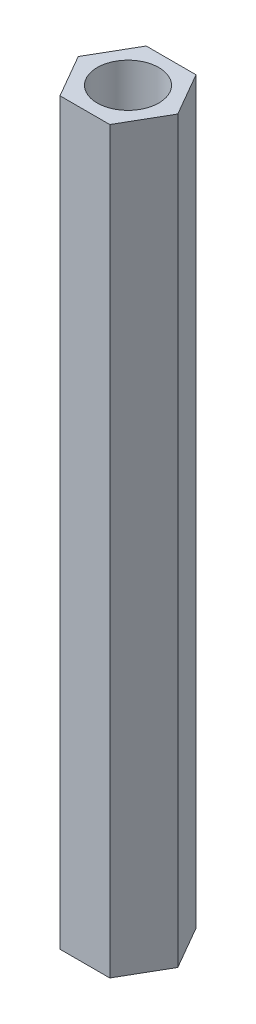
ISO-10303-21;
HEADER;
FILE_DESCRIPTION(('STEP AP214'),'2;1');
FILE_NAME('part.step','',(''),(''),'','','');
FILE_SCHEMA(('AUTOMOTIVE_DESIGN { 1 0 10303 214 1 1 1 1 }'));
ENDSEC;
DATA;
#1=APPLICATION_CONTEXT('core data for automotive mechanical design processes');
#2=APPLICATION_PROTOCOL_DEFINITION('international standard','automotive_design',2000,#1);
#3=PRODUCT_CONTEXT('',#1,'mechanical');
#4=PRODUCT('Part','Part','',(#3));
#5=PRODUCT_RELATED_PRODUCT_CATEGORY('part','',(#4));
#6=PRODUCT_DEFINITION_FORMATION('','',#4);
#7=PRODUCT_DEFINITION_CONTEXT('part definition',#1,'design');
#8=PRODUCT_DEFINITION('design','',#6,#7);
#9=PRODUCT_DEFINITION_SHAPE('','',#8);
#10=(LENGTH_UNIT() NAMED_UNIT(*) SI_UNIT(.MILLI.,.METRE.));
#11=(NAMED_UNIT(*) PLANE_ANGLE_UNIT() SI_UNIT($,.RADIAN.));
#12=(NAMED_UNIT(*) SI_UNIT($,.STERADIAN.) SOLID_ANGLE_UNIT());
#13=UNCERTAINTY_MEASURE_WITH_UNIT(LENGTH_MEASURE(1.E-05),#10,'distance_accuracy_value','');
#14=(GEOMETRIC_REPRESENTATION_CONTEXT(3) GLOBAL_UNCERTAINTY_ASSIGNED_CONTEXT((#13)) GLOBAL_UNIT_ASSIGNED_CONTEXT((#10,
#11,#12)) REPRESENTATION_CONTEXT('',''));
#15=CARTESIAN_POINT('',(0.,0.,0.));
#16=DIRECTION('',(0.,0.,1.));
#17=DIRECTION('',(1.,0.,0.));
#18=AXIS2_PLACEMENT_3D('',#15,#16,#17);
#19=CARTESIAN_POINT('',(0.,60.,0.));
#20=DIRECTION('',(0.,1.,0.));
#21=DIRECTION('',(0.,0.,1.));
#22=AXIS2_PLACEMENT_3D('',#19,#20,#21);
#23=PLANE('',#22);
#24=DIRECTION('',(-0.5,0.,-0.866025403784439));
#25=VECTOR('',#24,1.);
#26=CARTESIAN_POINT('',(4.04145188432738,60.,0.));
#27=LINE('',#26,#25);
#28=CARTESIAN_POINT('',(4.04145188432738,60.,0.));
#29=VERTEX_POINT('',#28);
#30=CARTESIAN_POINT('',(2.02072594216369,60.,-3.5));
#31=VERTEX_POINT('',#30);
#32=EDGE_CURVE('E152',#29,#31,#27,.T.);
#33=ORIENTED_EDGE('',*,*,#32,.T.);
#34=DIRECTION('',(-1.,0.,0.));
#35=VECTOR('',#34,1.);
#36=CARTESIAN_POINT('',(2.02072594216369,60.,-3.5));
#37=LINE('',#36,#35);
#38=CARTESIAN_POINT('',(-2.02072594216369,60.,-3.5));
#39=VERTEX_POINT('',#38);
#40=EDGE_CURVE('E100',#31,#39,#37,.T.);
#41=ORIENTED_EDGE('',*,*,#40,.T.);
#42=DIRECTION('',(-0.5,0.,0.866025403784439));
#43=VECTOR('',#42,1.);
#44=CARTESIAN_POINT('',(-2.02072594216369,60.,-3.5));
#45=LINE('',#44,#43);
#46=CARTESIAN_POINT('',(-4.04145188432738,60.,0.));
#47=VERTEX_POINT('',#46);
#48=EDGE_CURVE('E113',#39,#47,#45,.T.);
#49=ORIENTED_EDGE('',*,*,#48,.T.);
#50=DIRECTION('',(0.5,0.,0.866025403784439));
#51=VECTOR('',#50,1.);
#52=CARTESIAN_POINT('',(-4.04145188432738,60.,0.));
#53=LINE('',#52,#51);
#54=CARTESIAN_POINT('',(-2.02072594216369,60.,3.5));
#55=VERTEX_POINT('',#54);
#56=EDGE_CURVE('E107',#47,#55,#53,.T.);
#57=ORIENTED_EDGE('',*,*,#56,.T.);
#58=DIRECTION('',(1.,0.,0.));
#59=VECTOR('',#58,1.);
#60=CARTESIAN_POINT('',(-2.02072594216369,60.,3.5));
#61=LINE('',#60,#59);
#62=CARTESIAN_POINT('',(2.02072594216369,60.,3.5));
#63=VERTEX_POINT('',#62);
#64=EDGE_CURVE('E111',#55,#63,#61,.T.);
#65=ORIENTED_EDGE('',*,*,#64,.T.);
#66=DIRECTION('',(0.5,0.,-0.866025403784438));
#67=VECTOR('',#66,1.);
#68=CARTESIAN_POINT('',(2.02072594216369,60.,3.5));
#69=LINE('',#68,#67);
#70=EDGE_CURVE('E63',#63,#29,#69,.T.);
#71=ORIENTED_EDGE('',*,*,#70,.T.);
#72=EDGE_LOOP('',(#33,#41,#49,#57,#65,#71));
#73=FACE_BOUND('',#72,.T.);
#74=CARTESIAN_POINT('',(0.,60.,0.));
#75=DIRECTION('',(0.,1.,0.));
#76=DIRECTION('',(0.,0.,1.));
#77=AXIS2_PLACEMENT_3D('',#74,#75,#76);
#78=CIRCLE('',#77,2.5);
#79=CARTESIAN_POINT('',(0.,60.,2.5));
#80=VERTEX_POINT('',#79);
#81=EDGE_CURVE('E140',#80,#80,#78,.T.);
#82=ORIENTED_EDGE('',*,*,#81,.F.);
#83=EDGE_LOOP('',(#82));
#84=FACE_BOUND('',#83,.T.);
#85=ADVANCED_FACE('F45',(#73,#84),#23,.T.);
#86=CARTESIAN_POINT('',(0.,0.,0.));
#87=DIRECTION('',(0.,1.,0.));
#88=DIRECTION('',(0.,0.,1.));
#89=AXIS2_PLACEMENT_3D('',#86,#87,#88);
#90=PLANE('',#89);
#91=DIRECTION('',(-0.5,0.,-0.866025403784439));
#92=VECTOR('',#91,1.);
#93=CARTESIAN_POINT('',(4.04145188432738,0.,0.));
#94=LINE('',#93,#92);
#95=CARTESIAN_POINT('',(4.04145188432738,0.,0.));
#96=VERTEX_POINT('',#95);
#97=CARTESIAN_POINT('',(2.02072594216369,0.,-3.5));
#98=VERTEX_POINT('',#97);
#99=EDGE_CURVE('E135',#96,#98,#94,.T.);
#100=ORIENTED_EDGE('',*,*,#99,.F.);
#101=DIRECTION('',(0.5,0.,-0.866025403784438));
#102=VECTOR('',#101,1.);
#103=CARTESIAN_POINT('',(2.02072594216369,0.,3.5));
#104=LINE('',#103,#102);
#105=CARTESIAN_POINT('',(2.02072594216369,0.,3.5));
#106=VERTEX_POINT('',#105);
#107=EDGE_CURVE('E92',#106,#96,#104,.T.);
#108=ORIENTED_EDGE('',*,*,#107,.F.);
#109=DIRECTION('',(1.,0.,0.));
#110=VECTOR('',#109,1.);
#111=CARTESIAN_POINT('',(-2.02072594216369,0.,3.5));
#112=LINE('',#111,#110);
#113=CARTESIAN_POINT('',(-2.02072594216369,0.,3.5));
#114=VERTEX_POINT('',#113);
#115=EDGE_CURVE('E86',#114,#106,#112,.T.);
#116=ORIENTED_EDGE('',*,*,#115,.F.);
#117=DIRECTION('',(0.5,0.,0.866025403784439));
#118=VECTOR('',#117,1.);
#119=CARTESIAN_POINT('',(-4.04145188432738,0.,0.));
#120=LINE('',#119,#118);
#121=CARTESIAN_POINT('',(-4.04145188432738,0.,0.));
#122=VERTEX_POINT('',#121);
#123=EDGE_CURVE('E122',#122,#114,#120,.T.);
#124=ORIENTED_EDGE('',*,*,#123,.F.);
#125=DIRECTION('',(-0.5,0.,0.866025403784439));
#126=VECTOR('',#125,1.);
#127=CARTESIAN_POINT('',(-2.02072594216369,0.,-3.5));
#128=LINE('',#127,#126);
#129=CARTESIAN_POINT('',(-2.02072594216369,0.,-3.5));
#130=VERTEX_POINT('',#129);
#131=EDGE_CURVE('E143',#130,#122,#128,.T.);
#132=ORIENTED_EDGE('',*,*,#131,.F.);
#133=DIRECTION('',(-1.,0.,0.));
#134=VECTOR('',#133,1.);
#135=CARTESIAN_POINT('',(2.02072594216369,0.,-3.5));
#136=LINE('',#135,#134);
#137=EDGE_CURVE('E139',#98,#130,#136,.T.);
#138=ORIENTED_EDGE('',*,*,#137,.F.);
#139=EDGE_LOOP('',(#100,#108,#116,#124,#132,#138));
#140=FACE_BOUND('',#139,.T.);
#141=CARTESIAN_POINT('',(0.,0.,0.));
#142=DIRECTION('',(0.,1.,0.));
#143=DIRECTION('',(0.,0.,1.));
#144=AXIS2_PLACEMENT_3D('',#141,#142,#143);
#145=CIRCLE('',#144,2.5);
#146=CARTESIAN_POINT('',(0.,0.,2.5));
#147=VERTEX_POINT('',#146);
#148=EDGE_CURVE('E249',#147,#147,#145,.T.);
#149=ORIENTED_EDGE('',*,*,#148,.T.);
#150=EDGE_LOOP('',(#149));
#151=FACE_BOUND('',#150,.T.);
#152=ADVANCED_FACE('F165',(#140,#151),#90,.F.);
#153=CARTESIAN_POINT('',(4.04145188432738,60.,0.));
#154=DIRECTION('',(-0.866025403784439,0.,0.5));
#155=DIRECTION('',(0.5,0.,0.866025403784439));
#156=AXIS2_PLACEMENT_3D('',#153,#154,#155);
#157=PLANE('',#156);
#158=ORIENTED_EDGE('',*,*,#99,.T.);
#159=DIRECTION('',(0.,-1.,0.));
#160=VECTOR('',#159,1.);
#161=CARTESIAN_POINT('',(2.02072594216369,60.,-3.5));
#162=LINE('',#161,#160);
#163=EDGE_CURVE('E11',#31,#98,#162,.T.);
#164=ORIENTED_EDGE('',*,*,#163,.F.);
#165=ORIENTED_EDGE('',*,*,#32,.F.);
#166=DIRECTION('',(0.,-1.,0.));
#167=VECTOR('',#166,1.);
#168=CARTESIAN_POINT('',(4.04145188432738,60.,0.));
#169=LINE('',#168,#167);
#170=EDGE_CURVE('E131',#29,#96,#169,.T.);
#171=ORIENTED_EDGE('',*,*,#170,.T.);
#172=EDGE_LOOP('',(#158,#164,#165,#171));
#173=FACE_BOUND('',#172,.T.);
#174=ADVANCED_FACE('F47',(#173),#157,.F.);
#175=CARTESIAN_POINT('',(2.02072594216369,60.,-3.5));
#176=DIRECTION('',(0.,0.,1.));
#177=DIRECTION('',(1.,0.,0.));
#178=AXIS2_PLACEMENT_3D('',#175,#176,#177);
#179=PLANE('',#178);
#180=ORIENTED_EDGE('',*,*,#137,.T.);
#181=DIRECTION('',(0.,-1.,0.));
#182=VECTOR('',#181,1.);
#183=CARTESIAN_POINT('',(-2.02072594216369,60.,-3.5));
#184=LINE('',#183,#182);
#185=EDGE_CURVE('E55',#39,#130,#184,.T.);
#186=ORIENTED_EDGE('',*,*,#185,.F.);
#187=ORIENTED_EDGE('',*,*,#40,.F.);
#188=ORIENTED_EDGE('',*,*,#163,.T.);
#189=EDGE_LOOP('',(#180,#186,#187,#188));
#190=FACE_BOUND('',#189,.T.);
#191=ADVANCED_FACE('F190',(#190),#179,.F.);
#192=CARTESIAN_POINT('',(-2.02072594216369,60.,-3.5));
#193=DIRECTION('',(0.866025403784439,0.,0.5));
#194=DIRECTION('',(0.5,0.,-0.866025403784439));
#195=AXIS2_PLACEMENT_3D('',#192,#193,#194);
#196=PLANE('',#195);
#197=ORIENTED_EDGE('',*,*,#131,.T.);
#198=DIRECTION('',(0.,-1.,0.));
#199=VECTOR('',#198,1.);
#200=CARTESIAN_POINT('',(-4.04145188432738,60.,0.));
#201=LINE('',#200,#199);
#202=EDGE_CURVE('E124',#47,#122,#201,.T.);
#203=ORIENTED_EDGE('',*,*,#202,.F.);
#204=ORIENTED_EDGE('',*,*,#48,.F.);
#205=ORIENTED_EDGE('',*,*,#185,.T.);
#206=EDGE_LOOP('',(#197,#203,#204,#205));
#207=FACE_BOUND('',#206,.T.);
#208=ADVANCED_FACE('F162',(#207),#196,.F.);
#209=CARTESIAN_POINT('',(-4.04145188432738,60.,0.));
#210=DIRECTION('',(0.866025403784439,0.,-0.5));
#211=DIRECTION('',(-0.5,0.,-0.866025403784439));
#212=AXIS2_PLACEMENT_3D('',#209,#210,#211);
#213=PLANE('',#212);
#214=ORIENTED_EDGE('',*,*,#123,.T.);
#215=DIRECTION('',(0.,-1.,0.));
#216=VECTOR('',#215,1.);
#217=CARTESIAN_POINT('',(-2.02072594216369,60.,3.5));
#218=LINE('',#217,#216);
#219=EDGE_CURVE('E119',#55,#114,#218,.T.);
#220=ORIENTED_EDGE('',*,*,#219,.F.);
#221=ORIENTED_EDGE('',*,*,#56,.F.);
#222=ORIENTED_EDGE('',*,*,#202,.T.);
#223=EDGE_LOOP('',(#214,#220,#221,#222));
#224=FACE_BOUND('',#223,.T.);
#225=ADVANCED_FACE('F120',(#224),#213,.F.);
#226=CARTESIAN_POINT('',(-2.02072594216369,60.,3.5));
#227=DIRECTION('',(0.,0.,-1.));
#228=DIRECTION('',(-1.,0.,0.));
#229=AXIS2_PLACEMENT_3D('',#226,#227,#228);
#230=PLANE('',#229);
#231=ORIENTED_EDGE('',*,*,#115,.T.);
#232=DIRECTION('',(0.,-1.,0.));
#233=VECTOR('',#232,1.);
#234=CARTESIAN_POINT('',(2.02072594216369,60.,3.5));
#235=LINE('',#234,#233);
#236=EDGE_CURVE('E125',#63,#106,#235,.T.);
#237=ORIENTED_EDGE('',*,*,#236,.F.);
#238=ORIENTED_EDGE('',*,*,#64,.F.);
#239=ORIENTED_EDGE('',*,*,#219,.T.);
#240=EDGE_LOOP('',(#231,#237,#238,#239));
#241=FACE_BOUND('',#240,.T.);
#242=ADVANCED_FACE('F127',(#241),#230,.F.);
#243=CARTESIAN_POINT('',(2.02072594216369,60.,3.5));
#244=DIRECTION('',(-0.866025403784438,0.,-0.5));
#245=DIRECTION('',(-0.5,0.,0.866025403784438));
#246=AXIS2_PLACEMENT_3D('',#243,#244,#245);
#247=PLANE('',#246);
#248=ORIENTED_EDGE('',*,*,#107,.T.);
#249=ORIENTED_EDGE('',*,*,#170,.F.);
#250=ORIENTED_EDGE('',*,*,#70,.F.);
#251=ORIENTED_EDGE('',*,*,#236,.T.);
#252=EDGE_LOOP('',(#248,#249,#250,#251));
#253=FACE_BOUND('',#252,.T.);
#254=ADVANCED_FACE('F170',(#253),#247,.F.);
#255=CARTESIAN_POINT('',(0.,60.,0.));
#256=DIRECTION('',(0.,-1.,0.));
#257=DIRECTION('',(0.,0.,-1.));
#258=AXIS2_PLACEMENT_3D('',#255,#256,#257);
#259=CYLINDRICAL_SURFACE('',#258,2.5);
#260=ORIENTED_EDGE('',*,*,#81,.T.);
#261=EDGE_LOOP('',(#260));
#262=FACE_BOUND('',#261,.T.);
#263=ORIENTED_EDGE('',*,*,#148,.F.);
#264=EDGE_LOOP('',(#263));
#265=FACE_BOUND('',#264,.T.);
#266=ADVANCED_FACE('F172',(#262,#265),#259,.F.);
#267=CLOSED_SHELL('',(#85,#152,#174,#191,#208,#225,#242,#254,#266));
#268=MANIFOLD_SOLID_BREP('B2',#267);
#269=ADVANCED_BREP_SHAPE_REPRESENTATION('',(#18,#268),#14);
#270=SHAPE_DEFINITION_REPRESENTATION(#9,#269);
ENDSEC;
END-ISO-10303-21;
